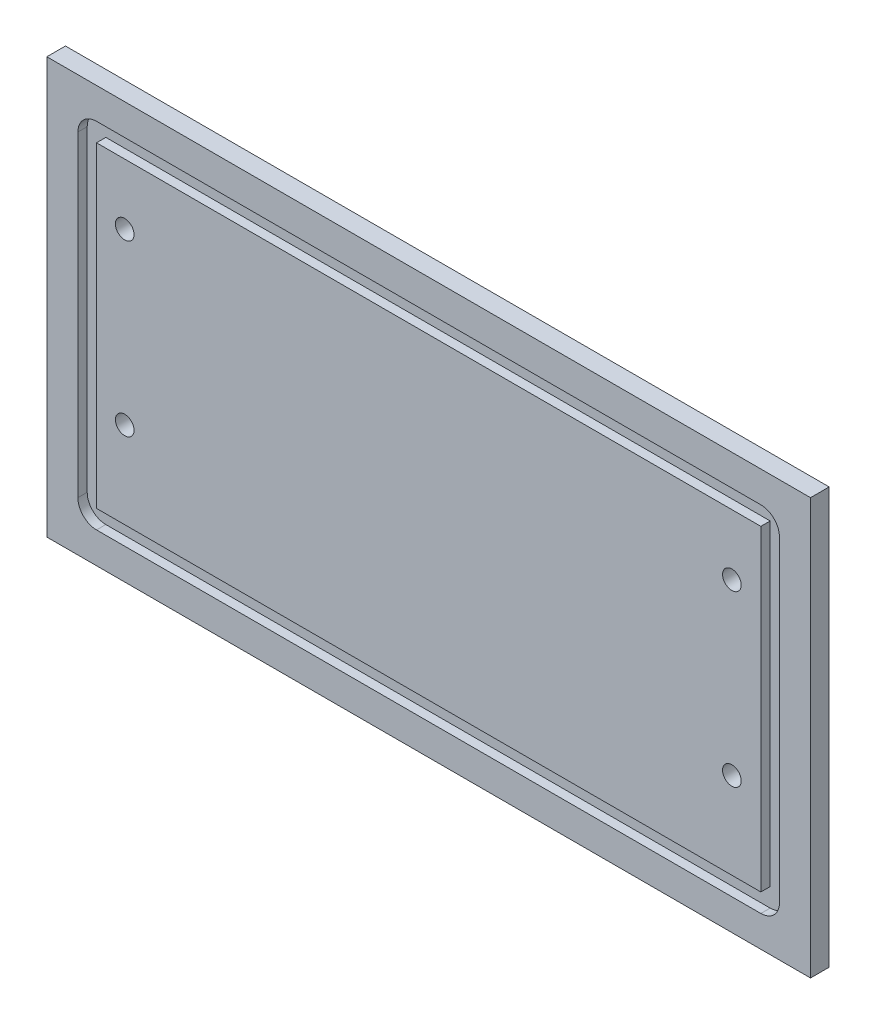
ISO-10303-21;
HEADER;
FILE_DESCRIPTION(('STEP AP214'),'2;1');
FILE_NAME('part.step','',(''),(''),'','','');
FILE_SCHEMA(('AUTOMOTIVE_DESIGN { 1 0 10303 214 1 1 1 1 }'));
ENDSEC;
DATA;
#1=APPLICATION_CONTEXT('core data for automotive mechanical design processes');
#2=APPLICATION_PROTOCOL_DEFINITION('international standard','automotive_design',2000,#1);
#3=PRODUCT_CONTEXT('',#1,'mechanical');
#4=PRODUCT('Part','Part','',(#3));
#5=PRODUCT_RELATED_PRODUCT_CATEGORY('part','',(#4));
#6=PRODUCT_DEFINITION_FORMATION('','',#4);
#7=PRODUCT_DEFINITION_CONTEXT('part definition',#1,'design');
#8=PRODUCT_DEFINITION('design','',#6,#7);
#9=PRODUCT_DEFINITION_SHAPE('','',#8);
#10=(LENGTH_UNIT() NAMED_UNIT(*) SI_UNIT(.MILLI.,.METRE.));
#11=(NAMED_UNIT(*) PLANE_ANGLE_UNIT() SI_UNIT($,.RADIAN.));
#12=(NAMED_UNIT(*) SI_UNIT($,.STERADIAN.) SOLID_ANGLE_UNIT());
#13=UNCERTAINTY_MEASURE_WITH_UNIT(LENGTH_MEASURE(1.E-05),#10,'distance_accuracy_value','');
#14=(GEOMETRIC_REPRESENTATION_CONTEXT(3) GLOBAL_UNCERTAINTY_ASSIGNED_CONTEXT((#13)) GLOBAL_UNIT_ASSIGNED_CONTEXT((#10,
#11,#12)) REPRESENTATION_CONTEXT('',''));
#15=CARTESIAN_POINT('',(0.,0.,0.));
#16=DIRECTION('',(0.,0.,1.));
#17=DIRECTION('',(1.,0.,0.));
#18=AXIS2_PLACEMENT_3D('',#15,#16,#17);
#19=CARTESIAN_POINT('',(2.,56.,1.5));
#20=DIRECTION('',(0.,1.,0.));
#21=DIRECTION('',(1.,0.,0.));
#22=AXIS2_PLACEMENT_3D('',#19,#20,#21);
#23=PLANE('',#22);
#24=DIRECTION('',(1.,0.,0.));
#25=VECTOR('',#24,1.);
#26=CARTESIAN_POINT('',(2.,56.,1.5));
#27=LINE('',#26,#25);
#28=CARTESIAN_POINT('',(5.,56.,1.5));
#29=VERTEX_POINT('',#28);
#30=CARTESIAN_POINT('',(112.,56.,1.5));
#31=VERTEX_POINT('',#30);
#32=EDGE_CURVE('E405',#29,#31,#27,.T.);
#33=ORIENTED_EDGE('',*,*,#32,.F.);
#34=DIRECTION('',(0.,0.,1.));
#35=VECTOR('',#34,1.);
#36=CARTESIAN_POINT('',(5.,56.,1.5));
#37=LINE('',#36,#35);
#38=CARTESIAN_POINT('',(5.,56.,3.));
#39=VERTEX_POINT('',#38);
#40=EDGE_CURVE('E9',#29,#39,#37,.T.);
#41=ORIENTED_EDGE('',*,*,#40,.T.);
#42=DIRECTION('',(-1.,0.,0.));
#43=VECTOR('',#42,1.);
#44=CARTESIAN_POINT('',(-0.5,56.,3.));
#45=LINE('',#44,#43);
#46=CARTESIAN_POINT('',(112.,56.,3.));
#47=VERTEX_POINT('',#46);
#48=EDGE_CURVE('E319',#47,#39,#45,.T.);
#49=ORIENTED_EDGE('',*,*,#48,.F.);
#50=DIRECTION('',(0.,0.,1.));
#51=VECTOR('',#50,1.);
#52=CARTESIAN_POINT('',(112.,56.,1.5));
#53=LINE('',#52,#51);
#54=EDGE_CURVE('E18',#31,#47,#53,.T.);
#55=ORIENTED_EDGE('',*,*,#54,.F.);
#56=EDGE_LOOP('',(#33,#41,#49,#55));
#57=FACE_BOUND('',#56,.T.);
#58=ADVANCED_FACE('F15',(#57),#23,.T.);
#59=CARTESIAN_POINT('',(5.,5.,1.5));
#60=DIRECTION('',(1.,0.,0.));
#61=DIRECTION('',(0.,1.,0.));
#62=AXIS2_PLACEMENT_3D('',#59,#60,#61);
#63=PLANE('',#62);
#64=ORIENTED_EDGE('',*,*,#40,.F.);
#65=DIRECTION('',(0.,1.,0.));
#66=VECTOR('',#65,1.);
#67=CARTESIAN_POINT('',(5.,5.,1.5));
#68=LINE('',#67,#66);
#69=CARTESIAN_POINT('',(5.,5.,1.5));
#70=VERTEX_POINT('',#69);
#71=EDGE_CURVE('E254',#70,#29,#68,.T.);
#72=ORIENTED_EDGE('',*,*,#71,.F.);
#73=DIRECTION('',(0.,0.,1.));
#74=VECTOR('',#73,1.);
#75=CARTESIAN_POINT('',(5.,5.,1.5));
#76=LINE('',#75,#74);
#77=CARTESIAN_POINT('',(5.,5.,3.));
#78=VERTEX_POINT('',#77);
#79=EDGE_CURVE('E24',#70,#78,#76,.T.);
#80=ORIENTED_EDGE('',*,*,#79,.T.);
#81=DIRECTION('',(0.,1.,0.));
#82=VECTOR('',#81,1.);
#83=CARTESIAN_POINT('',(5.,1.,3.));
#84=LINE('',#83,#82);
#85=EDGE_CURVE('E409',#78,#39,#84,.T.);
#86=ORIENTED_EDGE('',*,*,#85,.T.);
#87=EDGE_LOOP('',(#64,#72,#80,#86));
#88=FACE_BOUND('',#87,.T.);
#89=ADVANCED_FACE('F611',(#88),#63,.F.);
#90=CARTESIAN_POINT('',(115.,5.,1.5));
#91=DIRECTION('',(0.,-1.,0.));
#92=DIRECTION('',(0.,0.,-1.));
#93=AXIS2_PLACEMENT_3D('',#90,#91,#92);
#94=PLANE('',#93);
#95=DIRECTION('',(-1.,0.,0.));
#96=VECTOR('',#95,1.);
#97=CARTESIAN_POINT('',(115.,5.,1.5));
#98=LINE('',#97,#96);
#99=CARTESIAN_POINT('',(112.,5.,1.5));
#100=VERTEX_POINT('',#99);
#101=EDGE_CURVE('E250',#100,#70,#98,.T.);
#102=ORIENTED_EDGE('',*,*,#101,.F.);
#103=DIRECTION('',(0.,0.,1.));
#104=VECTOR('',#103,1.);
#105=CARTESIAN_POINT('',(112.,5.,1.5));
#106=LINE('',#105,#104);
#107=CARTESIAN_POINT('',(112.,5.,3.));
#108=VERTEX_POINT('',#107);
#109=EDGE_CURVE('E46',#100,#108,#106,.T.);
#110=ORIENTED_EDGE('',*,*,#109,.T.);
#111=DIRECTION('',(1.,0.,0.));
#112=VECTOR('',#111,1.);
#113=CARTESIAN_POINT('',(56.,5.,3.));
#114=LINE('',#113,#112);
#115=EDGE_CURVE('E377',#78,#108,#114,.T.);
#116=ORIENTED_EDGE('',*,*,#115,.F.);
#117=ORIENTED_EDGE('',*,*,#79,.F.);
#118=EDGE_LOOP('',(#102,#110,#116,#117));
#119=FACE_BOUND('',#118,.T.);
#120=ADVANCED_FACE('F603',(#119),#94,.T.);
#121=CARTESIAN_POINT('',(112.,5.,1.5));
#122=DIRECTION('',(1.,0.,0.));
#123=DIRECTION('',(0.,1.,0.));
#124=AXIS2_PLACEMENT_3D('',#121,#122,#123);
#125=PLANE('',#124);
#126=DIRECTION('',(0.,1.,0.));
#127=VECTOR('',#126,1.);
#128=CARTESIAN_POINT('',(112.,1.,3.));
#129=LINE('',#128,#127);
#130=EDGE_CURVE('E323',#108,#47,#129,.T.);
#131=ORIENTED_EDGE('',*,*,#130,.F.);
#132=ORIENTED_EDGE('',*,*,#109,.F.);
#133=DIRECTION('',(0.,1.,0.));
#134=VECTOR('',#133,1.);
#135=CARTESIAN_POINT('',(112.,5.,1.5));
#136=LINE('',#135,#134);
#137=EDGE_CURVE('E255',#100,#31,#136,.T.);
#138=ORIENTED_EDGE('',*,*,#137,.T.);
#139=ORIENTED_EDGE('',*,*,#54,.T.);
#140=EDGE_LOOP('',(#131,#132,#138,#139));
#141=FACE_BOUND('',#140,.T.);
#142=ADVANCED_FACE('F594',(#141),#125,.T.);
#143=CARTESIAN_POINT('',(-3.,-3.,3.));
#144=DIRECTION('',(0.,0.,1.));
#145=DIRECTION('',(1.,0.,0.));
#146=AXIS2_PLACEMENT_3D('',#143,#144,#145);
#147=PLANE('',#146);
#148=CARTESIAN_POINT('',(107.33304022333,46.215822366703,3.));
#149=DIRECTION('',(0.,0.,-1.));
#150=DIRECTION('',(1.,0.,0.));
#151=AXIS2_PLACEMENT_3D('',#148,#149,#150);
#152=CIRCLE('',#151,1.5);
#153=CARTESIAN_POINT('',(108.83304022333,46.215822366703,3.));
#154=VERTEX_POINT('',#153);
#155=EDGE_CURVE('E268',#154,#154,#152,.T.);
#156=ORIENTED_EDGE('',*,*,#155,.T.);
#157=EDGE_LOOP('',(#156));
#158=FACE_BOUND('',#157,.T.);
#159=CARTESIAN_POINT('',(9.543041215151,46.215822366703,3.));
#160=DIRECTION('',(0.,0.,-1.));
#161=DIRECTION('',(1.,0.,0.));
#162=AXIS2_PLACEMENT_3D('',#159,#160,#161);
#163=CIRCLE('',#162,1.5);
#164=CARTESIAN_POINT('',(11.043041215151,46.215822366703,3.));
#165=VERTEX_POINT('',#164);
#166=EDGE_CURVE('E393',#165,#165,#163,.T.);
#167=ORIENTED_EDGE('',*,*,#166,.T.);
#168=EDGE_LOOP('',(#167));
#169=FACE_BOUND('',#168,.T.);
#170=CARTESIAN_POINT('',(107.33304022333,18.910823968876,3.));
#171=DIRECTION('',(0.,0.,-1.));
#172=DIRECTION('',(1.,0.,0.));
#173=AXIS2_PLACEMENT_3D('',#170,#171,#172);
#174=CIRCLE('',#173,1.5);
#175=CARTESIAN_POINT('',(108.83304022333,18.910823968876,3.));
#176=VERTEX_POINT('',#175);
#177=EDGE_CURVE('E386',#176,#176,#174,.T.);
#178=ORIENTED_EDGE('',*,*,#177,.T.);
#179=EDGE_LOOP('',(#178));
#180=FACE_BOUND('',#179,.T.);
#181=CARTESIAN_POINT('',(9.543041215151,18.910823968876,3.));
#182=DIRECTION('',(0.,0.,-1.));
#183=DIRECTION('',(1.,0.,0.));
#184=AXIS2_PLACEMENT_3D('',#181,#182,#183);
#185=CIRCLE('',#184,1.5);
#186=CARTESIAN_POINT('',(11.043041215151,18.910823968876,3.));
#187=VERTEX_POINT('',#186);
#188=EDGE_CURVE('E359',#187,#187,#185,.T.);
#189=ORIENTED_EDGE('',*,*,#188,.T.);
#190=EDGE_LOOP('',(#189));
#191=FACE_BOUND('',#190,.T.);
#192=ORIENTED_EDGE('',*,*,#85,.F.);
#193=ORIENTED_EDGE('',*,*,#115,.T.);
#194=ORIENTED_EDGE('',*,*,#130,.T.);
#195=ORIENTED_EDGE('',*,*,#48,.T.);
#196=EDGE_LOOP('',(#192,#193,#194,#195));
#197=FACE_BOUND('',#196,.T.);
#198=ADVANCED_FACE('F585',(#158,#169,#180,#191,#197),#147,.T.);
#199=CARTESIAN_POINT('',(112.,5.,1.5));
#200=DIRECTION('',(0.,0.,1.));
#201=DIRECTION('',(1.,0.,0.));
#202=AXIS2_PLACEMENT_3D('',#199,#200,#201);
#203=PLANE('',#202);
#204=DIRECTION('',(0.,1.,0.));
#205=VECTOR('',#204,1.);
#206=CARTESIAN_POINT('',(115.,5.,1.5));
#207=LINE('',#206,#205);
#208=CARTESIAN_POINT('',(115.,5.,1.5));
#209=VERTEX_POINT('',#208);
#210=CARTESIAN_POINT('',(115.,56.,1.5));
#211=VERTEX_POINT('',#210);
#212=EDGE_CURVE('E292',#209,#211,#207,.T.);
#213=ORIENTED_EDGE('',*,*,#212,.T.);
#214=CARTESIAN_POINT('',(112.,56.,1.5));
#215=DIRECTION('',(0.,0.,1.));
#216=DIRECTION('',(1.,0.,0.));
#217=AXIS2_PLACEMENT_3D('',#214,#215,#216);
#218=CIRCLE('',#217,3.);
#219=CARTESIAN_POINT('',(112.,59.,1.5));
#220=VERTEX_POINT('',#219);
#221=EDGE_CURVE('E330',#211,#220,#218,.T.);
#222=ORIENTED_EDGE('',*,*,#221,.T.);
#223=DIRECTION('',(-1.,0.,0.));
#224=VECTOR('',#223,1.);
#225=CARTESIAN_POINT('',(112.,59.,1.5));
#226=LINE('',#225,#224);
#227=CARTESIAN_POINT('',(5.,59.,1.5));
#228=VERTEX_POINT('',#227);
#229=EDGE_CURVE('E337',#220,#228,#226,.T.);
#230=ORIENTED_EDGE('',*,*,#229,.T.);
#231=CARTESIAN_POINT('',(5.,56.,1.5));
#232=DIRECTION('',(0.,0.,1.));
#233=DIRECTION('',(0.,1.,0.));
#234=AXIS2_PLACEMENT_3D('',#231,#232,#233);
#235=CIRCLE('',#234,3.);
#236=CARTESIAN_POINT('',(2.,56.,1.5));
#237=VERTEX_POINT('',#236);
#238=EDGE_CURVE('E344',#228,#237,#235,.T.);
#239=ORIENTED_EDGE('',*,*,#238,.T.);
#240=DIRECTION('',(0.,1.,0.));
#241=VECTOR('',#240,1.);
#242=CARTESIAN_POINT('',(2.,5.,1.5));
#243=LINE('',#242,#241);
#244=CARTESIAN_POINT('',(2.,5.,1.5));
#245=VERTEX_POINT('',#244);
#246=EDGE_CURVE('E259',#245,#237,#243,.T.);
#247=ORIENTED_EDGE('',*,*,#246,.F.);
#248=CARTESIAN_POINT('',(5.,5.,1.5));
#249=DIRECTION('',(0.,0.,1.));
#250=DIRECTION('',(-1.,0.,0.));
#251=AXIS2_PLACEMENT_3D('',#248,#249,#250);
#252=CIRCLE('',#251,3.);
#253=CARTESIAN_POINT('',(5.,2.,1.5));
#254=VERTEX_POINT('',#253);
#255=EDGE_CURVE('E352',#245,#254,#252,.T.);
#256=ORIENTED_EDGE('',*,*,#255,.T.);
#257=DIRECTION('',(1.,0.,0.));
#258=VECTOR('',#257,1.);
#259=CARTESIAN_POINT('',(5.,2.,1.5));
#260=LINE('',#259,#258);
#261=CARTESIAN_POINT('',(112.,2.,1.5));
#262=VERTEX_POINT('',#261);
#263=EDGE_CURVE('E366',#254,#262,#260,.T.);
#264=ORIENTED_EDGE('',*,*,#263,.T.);
#265=CARTESIAN_POINT('',(112.,5.,1.5));
#266=DIRECTION('',(0.,0.,1.));
#267=DIRECTION('',(0.,-1.,0.));
#268=AXIS2_PLACEMENT_3D('',#265,#266,#267);
#269=CIRCLE('',#268,3.);
#270=EDGE_CURVE('E373',#262,#209,#269,.T.);
#271=ORIENTED_EDGE('',*,*,#270,.T.);
#272=EDGE_LOOP('',(#213,#222,#230,#239,#247,#256,#264,#271));
#273=FACE_BOUND('',#272,.T.);
#274=ORIENTED_EDGE('',*,*,#137,.F.);
#275=ORIENTED_EDGE('',*,*,#101,.T.);
#276=ORIENTED_EDGE('',*,*,#71,.T.);
#277=ORIENTED_EDGE('',*,*,#32,.T.);
#278=EDGE_LOOP('',(#274,#275,#276,#277));
#279=FACE_BOUND('',#278,.T.);
#280=ADVANCED_FACE('F576',(#273,#279),#203,.T.);
#281=CARTESIAN_POINT('',(107.33304022333,46.215822366703,-0.5));
#282=DIRECTION('',(0.,0.,-1.));
#283=DIRECTION('',(1.,0.,0.));
#284=AXIS2_PLACEMENT_3D('',#281,#282,#283);
#285=CYLINDRICAL_SURFACE('',#284,1.5);
#286=CARTESIAN_POINT('',(107.33304022333,46.215822366703,0.));
#287=DIRECTION('',(0.,0.,-1.));
#288=DIRECTION('',(1.,0.,0.));
#289=AXIS2_PLACEMENT_3D('',#286,#287,#288);
#290=CIRCLE('',#289,1.5);
#291=CARTESIAN_POINT('',(108.83304022333,46.215822366703,0.));
#292=VERTEX_POINT('',#291);
#293=EDGE_CURVE('E293',#292,#292,#290,.T.);
#294=ORIENTED_EDGE('',*,*,#293,.T.);
#295=DIRECTION('',(0.,0.,1.));
#296=VECTOR('',#295,1.);
#297=CARTESIAN_POINT('',(108.83304022333,46.215822366703,-0.5));
#298=LINE('',#297,#296);
#299=EDGE_CURVE('E389',#292,#154,#298,.T.);
#300=ORIENTED_EDGE('',*,*,#299,.T.);
#301=ORIENTED_EDGE('',*,*,#155,.F.);
#302=ORIENTED_EDGE('',*,*,#299,.F.);
#303=EDGE_LOOP('',(#294,#300,#301,#302));
#304=FACE_BOUND('',#303,.T.);
#305=ADVANCED_FACE('F567',(#304),#285,.F.);
#306=CARTESIAN_POINT('',(9.543041215151,46.215822366703,-0.5));
#307=DIRECTION('',(0.,0.,-1.));
#308=DIRECTION('',(1.,0.,0.));
#309=AXIS2_PLACEMENT_3D('',#306,#307,#308);
#310=CYLINDRICAL_SURFACE('',#309,1.5);
#311=CARTESIAN_POINT('',(9.543041215151,46.215822366703,0.));
#312=DIRECTION('',(0.,0.,-1.));
#313=DIRECTION('',(1.,0.,0.));
#314=AXIS2_PLACEMENT_3D('',#311,#312,#313);
#315=CIRCLE('',#314,1.5);
#316=CARTESIAN_POINT('',(11.043041215151,46.215822366703,0.));
#317=VERTEX_POINT('',#316);
#318=EDGE_CURVE('E312',#317,#317,#315,.T.);
#319=ORIENTED_EDGE('',*,*,#318,.T.);
#320=DIRECTION('',(0.,0.,1.));
#321=VECTOR('',#320,1.);
#322=CARTESIAN_POINT('',(11.043041215151,46.215822366703,-0.5));
#323=LINE('',#322,#321);
#324=EDGE_CURVE('E396',#317,#165,#323,.T.);
#325=ORIENTED_EDGE('',*,*,#324,.T.);
#326=ORIENTED_EDGE('',*,*,#166,.F.);
#327=ORIENTED_EDGE('',*,*,#324,.F.);
#328=EDGE_LOOP('',(#319,#325,#326,#327));
#329=FACE_BOUND('',#328,.T.);
#330=ADVANCED_FACE('F543',(#329),#310,.F.);
#331=CARTESIAN_POINT('',(107.33304022333,18.910823968876,-0.5));
#332=DIRECTION('',(0.,0.,-1.));
#333=DIRECTION('',(1.,0.,0.));
#334=AXIS2_PLACEMENT_3D('',#331,#332,#333);
#335=CYLINDRICAL_SURFACE('',#334,1.5);
#336=CARTESIAN_POINT('',(107.33304022333,18.910823968876,0.));
#337=DIRECTION('',(0.,0.,-1.));
#338=DIRECTION('',(1.,0.,0.));
#339=AXIS2_PLACEMENT_3D('',#336,#337,#338);
#340=CIRCLE('',#339,1.5);
#341=CARTESIAN_POINT('',(108.83304022333,18.910823968876,0.));
#342=VERTEX_POINT('',#341);
#343=EDGE_CURVE('E307',#342,#342,#340,.T.);
#344=ORIENTED_EDGE('',*,*,#343,.T.);
#345=DIRECTION('',(0.,0.,1.));
#346=VECTOR('',#345,1.);
#347=CARTESIAN_POINT('',(108.83304022333,18.910823968876,-0.5));
#348=LINE('',#347,#346);
#349=EDGE_CURVE('E362',#342,#176,#348,.T.);
#350=ORIENTED_EDGE('',*,*,#349,.T.);
#351=ORIENTED_EDGE('',*,*,#177,.F.);
#352=ORIENTED_EDGE('',*,*,#349,.F.);
#353=EDGE_LOOP('',(#344,#350,#351,#352));
#354=FACE_BOUND('',#353,.T.);
#355=ADVANCED_FACE('F537',(#354),#335,.F.);
#356=CARTESIAN_POINT('',(9.543041215151,18.910823968876,-0.5));
#357=DIRECTION('',(0.,0.,-1.));
#358=DIRECTION('',(1.,0.,0.));
#359=AXIS2_PLACEMENT_3D('',#356,#357,#358);
#360=CYLINDRICAL_SURFACE('',#359,1.5);
#361=CARTESIAN_POINT('',(9.543041215151,18.910823968876,0.));
#362=DIRECTION('',(0.,0.,-1.));
#363=DIRECTION('',(1.,0.,0.));
#364=AXIS2_PLACEMENT_3D('',#361,#362,#363);
#365=CIRCLE('',#364,1.5);
#366=CARTESIAN_POINT('',(11.043041215151,18.910823968876,0.));
#367=VERTEX_POINT('',#366);
#368=EDGE_CURVE('E209',#367,#367,#365,.T.);
#369=ORIENTED_EDGE('',*,*,#368,.T.);
#370=DIRECTION('',(0.,0.,1.));
#371=VECTOR('',#370,1.);
#372=CARTESIAN_POINT('',(11.043041215151,18.910823968876,-0.5));
#373=LINE('',#372,#371);
#374=EDGE_CURVE('E363',#367,#187,#373,.T.);
#375=ORIENTED_EDGE('',*,*,#374,.T.);
#376=ORIENTED_EDGE('',*,*,#188,.F.);
#377=ORIENTED_EDGE('',*,*,#374,.F.);
#378=EDGE_LOOP('',(#369,#375,#376,#377));
#379=FACE_BOUND('',#378,.T.);
#380=ADVANCED_FACE('F542',(#379),#360,.F.);
#381=CARTESIAN_POINT('',(112.,5.,1.5));
#382=DIRECTION('',(0.,0.,-1.));
#383=DIRECTION('',(0.,-1.,0.));
#384=AXIS2_PLACEMENT_3D('',#381,#382,#383);
#385=CYLINDRICAL_SURFACE('',#384,3.);
#386=ORIENTED_EDGE('',*,*,#270,.F.);
#387=DIRECTION('',(0.,0.,1.));
#388=VECTOR('',#387,1.);
#389=CARTESIAN_POINT('',(112.,2.,1.5));
#390=LINE('',#389,#388);
#391=CARTESIAN_POINT('',(112.,2.,3.));
#392=VERTEX_POINT('',#391);
#393=EDGE_CURVE('E370',#262,#392,#390,.T.);
#394=ORIENTED_EDGE('',*,*,#393,.T.);
#395=CARTESIAN_POINT('',(112.,5.,3.));
#396=DIRECTION('',(0.,0.,-1.));
#397=DIRECTION('',(0.,-1.,0.));
#398=AXIS2_PLACEMENT_3D('',#395,#396,#397);
#399=CIRCLE('',#398,3.);
#400=CARTESIAN_POINT('',(115.,5.,3.));
#401=VERTEX_POINT('',#400);
#402=EDGE_CURVE('E266',#401,#392,#399,.T.);
#403=ORIENTED_EDGE('',*,*,#402,.F.);
#404=DIRECTION('',(0.,0.,1.));
#405=VECTOR('',#404,1.);
#406=CARTESIAN_POINT('',(115.,5.,1.5));
#407=LINE('',#406,#405);
#408=EDGE_CURVE('E327',#209,#401,#407,.T.);
#409=ORIENTED_EDGE('',*,*,#408,.F.);
#410=EDGE_LOOP('',(#386,#394,#403,#409));
#411=FACE_BOUND('',#410,.T.);
#412=ADVANCED_FACE('F509',(#411),#385,.F.);
#413=CARTESIAN_POINT('',(5.,2.,1.5));
#414=DIRECTION('',(0.,1.,0.));
#415=DIRECTION('',(1.,0.,0.));
#416=AXIS2_PLACEMENT_3D('',#413,#414,#415);
#417=PLANE('',#416);
#418=ORIENTED_EDGE('',*,*,#263,.F.);
#419=DIRECTION('',(0.,0.,1.));
#420=VECTOR('',#419,1.);
#421=CARTESIAN_POINT('',(5.,2.,1.5));
#422=LINE('',#421,#420);
#423=CARTESIAN_POINT('',(5.,2.,3.));
#424=VERTEX_POINT('',#423);
#425=EDGE_CURVE('E358',#254,#424,#422,.T.);
#426=ORIENTED_EDGE('',*,*,#425,.T.);
#427=DIRECTION('',(-1.,0.,0.));
#428=VECTOR('',#427,1.);
#429=CARTESIAN_POINT('',(1.,2.,3.));
#430=LINE('',#429,#428);
#431=EDGE_CURVE('E261',#392,#424,#430,.T.);
#432=ORIENTED_EDGE('',*,*,#431,.F.);
#433=ORIENTED_EDGE('',*,*,#393,.F.);
#434=EDGE_LOOP('',(#418,#426,#432,#433));
#435=FACE_BOUND('',#434,.T.);
#436=ADVANCED_FACE('F503',(#435),#417,.T.);
#437=CARTESIAN_POINT('',(5.,5.,1.5));
#438=DIRECTION('',(0.,0.,-1.));
#439=DIRECTION('',(-1.,0.,0.));
#440=AXIS2_PLACEMENT_3D('',#437,#438,#439);
#441=CYLINDRICAL_SURFACE('',#440,3.);
#442=ORIENTED_EDGE('',*,*,#255,.F.);
#443=DIRECTION('',(0.,0.,1.));
#444=VECTOR('',#443,1.);
#445=CARTESIAN_POINT('',(2.,5.,1.5));
#446=LINE('',#445,#444);
#447=CARTESIAN_POINT('',(2.,5.,3.));
#448=VERTEX_POINT('',#447);
#449=EDGE_CURVE('E256',#245,#448,#446,.T.);
#450=ORIENTED_EDGE('',*,*,#449,.T.);
#451=CARTESIAN_POINT('',(5.,5.,3.));
#452=DIRECTION('',(0.,0.,-1.));
#453=DIRECTION('',(-1.,0.,0.));
#454=AXIS2_PLACEMENT_3D('',#451,#452,#453);
#455=CIRCLE('',#454,3.);
#456=EDGE_CURVE('E265',#424,#448,#455,.T.);
#457=ORIENTED_EDGE('',*,*,#456,.F.);
#458=ORIENTED_EDGE('',*,*,#425,.F.);
#459=EDGE_LOOP('',(#442,#450,#457,#458));
#460=FACE_BOUND('',#459,.T.);
#461=ADVANCED_FACE('F508',(#460),#441,.F.);
#462=CARTESIAN_POINT('',(2.,5.,1.5));
#463=DIRECTION('',(1.,0.,0.));
#464=DIRECTION('',(0.,1.,0.));
#465=AXIS2_PLACEMENT_3D('',#462,#463,#464);
#466=PLANE('',#465);
#467=ORIENTED_EDGE('',*,*,#449,.F.);
#468=ORIENTED_EDGE('',*,*,#246,.T.);
#469=DIRECTION('',(0.,0.,1.));
#470=VECTOR('',#469,1.);
#471=CARTESIAN_POINT('',(2.,56.,1.5));
#472=LINE('',#471,#470);
#473=CARTESIAN_POINT('',(2.,56.,3.));
#474=VERTEX_POINT('',#473);
#475=EDGE_CURVE('E260',#237,#474,#472,.T.);
#476=ORIENTED_EDGE('',*,*,#475,.T.);
#477=DIRECTION('',(0.,1.,0.));
#478=VECTOR('',#477,1.);
#479=CARTESIAN_POINT('',(2.,1.,3.));
#480=LINE('',#479,#478);
#481=EDGE_CURVE('E247',#448,#474,#480,.T.);
#482=ORIENTED_EDGE('',*,*,#481,.F.);
#483=EDGE_LOOP('',(#467,#468,#476,#482));
#484=FACE_BOUND('',#483,.T.);
#485=ADVANCED_FACE('F466',(#484),#466,.T.);
#486=CARTESIAN_POINT('',(5.,56.,1.5));
#487=DIRECTION('',(0.,0.,-1.));
#488=DIRECTION('',(0.,1.,0.));
#489=AXIS2_PLACEMENT_3D('',#486,#487,#488);
#490=CYLINDRICAL_SURFACE('',#489,3.);
#491=ORIENTED_EDGE('',*,*,#238,.F.);
#492=DIRECTION('',(0.,0.,1.));
#493=VECTOR('',#492,1.);
#494=CARTESIAN_POINT('',(5.,59.,1.5));
#495=LINE('',#494,#493);
#496=CARTESIAN_POINT('',(5.,59.,3.));
#497=VERTEX_POINT('',#496);
#498=EDGE_CURVE('E341',#228,#497,#495,.T.);
#499=ORIENTED_EDGE('',*,*,#498,.T.);
#500=CARTESIAN_POINT('',(5.,56.,3.));
#501=DIRECTION('',(0.,0.,-1.));
#502=DIRECTION('',(0.,1.,0.));
#503=AXIS2_PLACEMENT_3D('',#500,#501,#502);
#504=CIRCLE('',#503,3.);
#505=EDGE_CURVE('E242',#474,#497,#504,.T.);
#506=ORIENTED_EDGE('',*,*,#505,.F.);
#507=ORIENTED_EDGE('',*,*,#475,.F.);
#508=EDGE_LOOP('',(#491,#499,#506,#507));
#509=FACE_BOUND('',#508,.T.);
#510=ADVANCED_FACE('F460',(#509),#490,.F.);
#511=CARTESIAN_POINT('',(112.,59.,1.5));
#512=DIRECTION('',(0.,-1.,0.));
#513=DIRECTION('',(-1.,0.,0.));
#514=AXIS2_PLACEMENT_3D('',#511,#512,#513);
#515=PLANE('',#514);
#516=ORIENTED_EDGE('',*,*,#229,.F.);
#517=DIRECTION('',(0.,0.,1.));
#518=VECTOR('',#517,1.);
#519=CARTESIAN_POINT('',(112.,59.,1.5));
#520=LINE('',#519,#518);
#521=CARTESIAN_POINT('',(112.,59.,3.));
#522=VERTEX_POINT('',#521);
#523=EDGE_CURVE('E334',#220,#522,#520,.T.);
#524=ORIENTED_EDGE('',*,*,#523,.T.);
#525=DIRECTION('',(1.,0.,0.));
#526=VECTOR('',#525,1.);
#527=CARTESIAN_POINT('',(54.5,59.,3.));
#528=LINE('',#527,#526);
#529=EDGE_CURVE('E246',#497,#522,#528,.T.);
#530=ORIENTED_EDGE('',*,*,#529,.F.);
#531=ORIENTED_EDGE('',*,*,#498,.F.);
#532=EDGE_LOOP('',(#516,#524,#530,#531));
#533=FACE_BOUND('',#532,.T.);
#534=ADVANCED_FACE('F465',(#533),#515,.T.);
#535=CARTESIAN_POINT('',(112.,56.,1.5));
#536=DIRECTION('',(0.,0.,-1.));
#537=DIRECTION('',(1.,0.,0.));
#538=AXIS2_PLACEMENT_3D('',#535,#536,#537);
#539=CYLINDRICAL_SURFACE('',#538,3.);
#540=ORIENTED_EDGE('',*,*,#221,.F.);
#541=DIRECTION('',(0.,0.,1.));
#542=VECTOR('',#541,1.);
#543=CARTESIAN_POINT('',(115.,56.,1.5));
#544=LINE('',#543,#542);
#545=CARTESIAN_POINT('',(115.,56.,3.));
#546=VERTEX_POINT('',#545);
#547=EDGE_CURVE('E289',#211,#546,#544,.T.);
#548=ORIENTED_EDGE('',*,*,#547,.T.);
#549=CARTESIAN_POINT('',(112.,56.,3.));
#550=DIRECTION('',(0.,0.,-1.));
#551=DIRECTION('',(1.,0.,0.));
#552=AXIS2_PLACEMENT_3D('',#549,#550,#551);
#553=CIRCLE('',#552,3.);
#554=EDGE_CURVE('E272',#522,#546,#553,.T.);
#555=ORIENTED_EDGE('',*,*,#554,.F.);
#556=ORIENTED_EDGE('',*,*,#523,.F.);
#557=EDGE_LOOP('',(#540,#548,#555,#556));
#558=FACE_BOUND('',#557,.T.);
#559=ADVANCED_FACE('F487',(#558),#539,.F.);
#560=CARTESIAN_POINT('',(115.,5.,1.5));
#561=DIRECTION('',(1.,0.,0.));
#562=DIRECTION('',(0.,1.,0.));
#563=AXIS2_PLACEMENT_3D('',#560,#561,#562);
#564=PLANE('',#563);
#565=DIRECTION('',(0.,1.,0.));
#566=VECTOR('',#565,1.);
#567=CARTESIAN_POINT('',(115.,1.,3.));
#568=LINE('',#567,#566);
#569=EDGE_CURVE('E279',#401,#546,#568,.T.);
#570=ORIENTED_EDGE('',*,*,#569,.T.);
#571=ORIENTED_EDGE('',*,*,#547,.F.);
#572=ORIENTED_EDGE('',*,*,#212,.F.);
#573=ORIENTED_EDGE('',*,*,#408,.T.);
#574=EDGE_LOOP('',(#570,#571,#572,#573));
#575=FACE_BOUND('',#574,.T.);
#576=ADVANCED_FACE('F445',(#575),#564,.F.);
#577=CARTESIAN_POINT('',(120.,-3.,0.));
#578=DIRECTION('',(1.,0.,0.));
#579=DIRECTION('',(0.,1.,0.));
#580=AXIS2_PLACEMENT_3D('',#577,#578,#579);
#581=PLANE('',#580);
#582=DIRECTION('',(0.,0.,1.));
#583=VECTOR('',#582,1.);
#584=CARTESIAN_POINT('',(120.,-3.,0.));
#585=LINE('',#584,#583);
#586=CARTESIAN_POINT('',(120.,-3.,0.));
#587=VERTEX_POINT('',#586);
#588=CARTESIAN_POINT('',(120.,-3.,3.));
#589=VERTEX_POINT('',#588);
#590=EDGE_CURVE('E215',#587,#589,#585,.T.);
#591=ORIENTED_EDGE('',*,*,#590,.F.);
#592=DIRECTION('',(0.,1.,0.));
#593=VECTOR('',#592,1.);
#594=CARTESIAN_POINT('',(120.,-3.,0.));
#595=LINE('',#594,#593);
#596=CARTESIAN_POINT('',(120.,64.,0.));
#597=VERTEX_POINT('',#596);
#598=EDGE_CURVE('E198',#587,#597,#595,.T.);
#599=ORIENTED_EDGE('',*,*,#598,.T.);
#600=DIRECTION('',(0.,0.,1.));
#601=VECTOR('',#600,1.);
#602=CARTESIAN_POINT('',(120.,64.,0.));
#603=LINE('',#602,#601);
#604=CARTESIAN_POINT('',(120.,64.,3.));
#605=VERTEX_POINT('',#604);
#606=EDGE_CURVE('E210',#597,#605,#603,.T.);
#607=ORIENTED_EDGE('',*,*,#606,.T.);
#608=DIRECTION('',(0.,1.,0.));
#609=VECTOR('',#608,1.);
#610=CARTESIAN_POINT('',(120.,-3.,3.));
#611=LINE('',#610,#609);
#612=EDGE_CURVE('E220',#589,#605,#611,.T.);
#613=ORIENTED_EDGE('',*,*,#612,.F.);
#614=EDGE_LOOP('',(#591,#599,#607,#613));
#615=FACE_BOUND('',#614,.T.);
#616=ADVANCED_FACE('F223',(#615),#581,.T.);
#617=CARTESIAN_POINT('',(-3.,-3.,0.));
#618=DIRECTION('',(0.,0.,1.));
#619=DIRECTION('',(1.,0.,0.));
#620=AXIS2_PLACEMENT_3D('',#617,#618,#619);
#621=PLANE('',#620);
#622=ORIENTED_EDGE('',*,*,#293,.F.);
#623=EDGE_LOOP('',(#622));
#624=FACE_BOUND('',#623,.T.);
#625=ORIENTED_EDGE('',*,*,#318,.F.);
#626=EDGE_LOOP('',(#625));
#627=FACE_BOUND('',#626,.T.);
#628=ORIENTED_EDGE('',*,*,#343,.F.);
#629=EDGE_LOOP('',(#628));
#630=FACE_BOUND('',#629,.T.);
#631=ORIENTED_EDGE('',*,*,#368,.F.);
#632=EDGE_LOOP('',(#631));
#633=FACE_BOUND('',#632,.T.);
#634=DIRECTION('',(1.,0.,0.));
#635=VECTOR('',#634,1.);
#636=CARTESIAN_POINT('',(-3.,64.,0.));
#637=LINE('',#636,#635);
#638=CARTESIAN_POINT('',(-3.,64.,0.));
#639=VERTEX_POINT('',#638);
#640=EDGE_CURVE('E204',#639,#597,#637,.T.);
#641=ORIENTED_EDGE('',*,*,#640,.T.);
#642=ORIENTED_EDGE('',*,*,#598,.F.);
#643=DIRECTION('',(1.,0.,0.));
#644=VECTOR('',#643,1.);
#645=CARTESIAN_POINT('',(-3.,-3.,0.));
#646=LINE('',#645,#644);
#647=CARTESIAN_POINT('',(-3.,-3.,0.));
#648=VERTEX_POINT('',#647);
#649=EDGE_CURVE('E202',#648,#587,#646,.T.);
#650=ORIENTED_EDGE('',*,*,#649,.F.);
#651=DIRECTION('',(0.,1.,0.));
#652=VECTOR('',#651,1.);
#653=CARTESIAN_POINT('',(-3.,-3.,0.));
#654=LINE('',#653,#652);
#655=EDGE_CURVE('E234',#648,#639,#654,.T.);
#656=ORIENTED_EDGE('',*,*,#655,.T.);
#657=EDGE_LOOP('',(#641,#642,#650,#656));
#658=FACE_BOUND('',#657,.T.);
#659=ADVANCED_FACE('F200',(#624,#627,#630,#633,#658),#621,.F.);
#660=CARTESIAN_POINT('',(-3.,64.,0.));
#661=DIRECTION('',(0.,1.,0.));
#662=DIRECTION('',(1.,0.,0.));
#663=AXIS2_PLACEMENT_3D('',#660,#661,#662);
#664=PLANE('',#663);
#665=ORIENTED_EDGE('',*,*,#640,.F.);
#666=DIRECTION('',(0.,0.,1.));
#667=VECTOR('',#666,1.);
#668=CARTESIAN_POINT('',(-3.,64.,0.));
#669=LINE('',#668,#667);
#670=CARTESIAN_POINT('',(-3.,64.,3.));
#671=VERTEX_POINT('',#670);
#672=EDGE_CURVE('E239',#639,#671,#669,.T.);
#673=ORIENTED_EDGE('',*,*,#672,.T.);
#674=DIRECTION('',(1.,0.,0.));
#675=VECTOR('',#674,1.);
#676=CARTESIAN_POINT('',(-3.,64.,3.));
#677=LINE('',#676,#675);
#678=EDGE_CURVE('E275',#671,#605,#677,.T.);
#679=ORIENTED_EDGE('',*,*,#678,.T.);
#680=ORIENTED_EDGE('',*,*,#606,.F.);
#681=EDGE_LOOP('',(#665,#673,#679,#680));
#682=FACE_BOUND('',#681,.T.);
#683=ADVANCED_FACE('F454',(#682),#664,.T.);
#684=CARTESIAN_POINT('',(-3.,-3.,3.));
#685=DIRECTION('',(0.,0.,1.));
#686=DIRECTION('',(1.,0.,0.));
#687=AXIS2_PLACEMENT_3D('',#684,#685,#686);
#688=PLANE('',#687);
#689=ORIENTED_EDGE('',*,*,#569,.F.);
#690=ORIENTED_EDGE('',*,*,#402,.T.);
#691=ORIENTED_EDGE('',*,*,#431,.T.);
#692=ORIENTED_EDGE('',*,*,#456,.T.);
#693=ORIENTED_EDGE('',*,*,#481,.T.);
#694=ORIENTED_EDGE('',*,*,#505,.T.);
#695=ORIENTED_EDGE('',*,*,#529,.T.);
#696=ORIENTED_EDGE('',*,*,#554,.T.);
#697=EDGE_LOOP('',(#689,#690,#691,#692,#693,#694,#695,#696));
#698=FACE_BOUND('',#697,.T.);
#699=DIRECTION('',(0.,1.,0.));
#700=VECTOR('',#699,1.);
#701=CARTESIAN_POINT('',(-3.,-3.,3.));
#702=LINE('',#701,#700);
#703=CARTESIAN_POINT('',(-3.,-3.,3.));
#704=VERTEX_POINT('',#703);
#705=EDGE_CURVE('E238',#704,#671,#702,.T.);
#706=ORIENTED_EDGE('',*,*,#705,.F.);
#707=DIRECTION('',(1.,0.,0.));
#708=VECTOR('',#707,1.);
#709=CARTESIAN_POINT('',(-3.,-3.,3.));
#710=LINE('',#709,#708);
#711=EDGE_CURVE('E221',#704,#589,#710,.T.);
#712=ORIENTED_EDGE('',*,*,#711,.T.);
#713=ORIENTED_EDGE('',*,*,#612,.T.);
#714=ORIENTED_EDGE('',*,*,#678,.F.);
#715=EDGE_LOOP('',(#706,#712,#713,#714));
#716=FACE_BOUND('',#715,.T.);
#717=ADVANCED_FACE('F436',(#698,#716),#688,.T.);
#718=CARTESIAN_POINT('',(-3.,-3.,0.));
#719=DIRECTION('',(0.,1.,0.));
#720=DIRECTION('',(1.,0.,0.));
#721=AXIS2_PLACEMENT_3D('',#718,#719,#720);
#722=PLANE('',#721);
#723=ORIENTED_EDGE('',*,*,#590,.T.);
#724=ORIENTED_EDGE('',*,*,#711,.F.);
#725=DIRECTION('',(0.,0.,1.));
#726=VECTOR('',#725,1.);
#727=CARTESIAN_POINT('',(-3.,-3.,0.));
#728=LINE('',#727,#726);
#729=EDGE_CURVE('E217',#648,#704,#728,.T.);
#730=ORIENTED_EDGE('',*,*,#729,.F.);
#731=ORIENTED_EDGE('',*,*,#649,.T.);
#732=EDGE_LOOP('',(#723,#724,#730,#731));
#733=FACE_BOUND('',#732,.T.);
#734=ADVANCED_FACE('F214',(#733),#722,.F.);
#735=CARTESIAN_POINT('',(-3.,-3.,0.));
#736=DIRECTION('',(1.,0.,0.));
#737=DIRECTION('',(0.,1.,0.));
#738=AXIS2_PLACEMENT_3D('',#735,#736,#737);
#739=PLANE('',#738);
#740=ORIENTED_EDGE('',*,*,#705,.T.);
#741=ORIENTED_EDGE('',*,*,#672,.F.);
#742=ORIENTED_EDGE('',*,*,#655,.F.);
#743=ORIENTED_EDGE('',*,*,#729,.T.);
#744=EDGE_LOOP('',(#740,#741,#742,#743));
#745=FACE_BOUND('',#744,.T.);
#746=ADVANCED_FACE('F422',(#745),#739,.F.);
#747=CLOSED_SHELL('',(#58,#89,#120,#142,#198,#280,#305,#330,#355,#380,#412,#436,#461,#485,#510,
#534,#559,#576,#616,#659,#683,#717,#734,#746));
#748=MANIFOLD_SOLID_BREP('B1',#747);
#749=ADVANCED_BREP_SHAPE_REPRESENTATION('',(#18,#748),#14);
#750=SHAPE_DEFINITION_REPRESENTATION(#9,#749);
ENDSEC;
END-ISO-10303-21;
